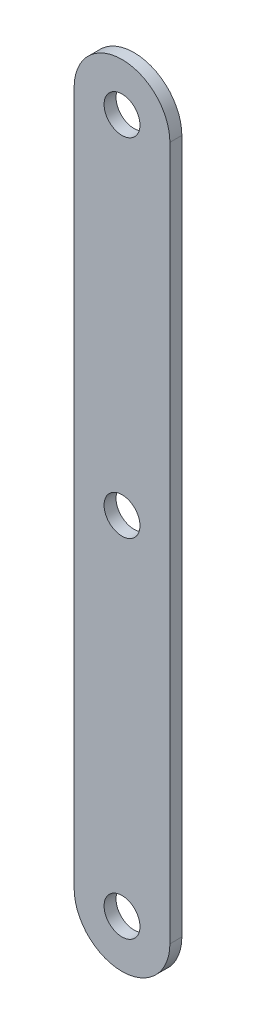
ISO-10303-21;
HEADER;
FILE_DESCRIPTION(('STEP AP214'),'2;1');
FILE_NAME('part.step','',(''),(''),'','','');
FILE_SCHEMA(('AUTOMOTIVE_DESIGN { 1 0 10303 214 1 1 1 1 }'));
ENDSEC;
DATA;
#1=APPLICATION_CONTEXT('core data for automotive mechanical design processes');
#2=APPLICATION_PROTOCOL_DEFINITION('international standard','automotive_design',2000,#1);
#3=PRODUCT_CONTEXT('',#1,'mechanical');
#4=PRODUCT('Part','Part','',(#3));
#5=PRODUCT_RELATED_PRODUCT_CATEGORY('part','',(#4));
#6=PRODUCT_DEFINITION_FORMATION('','',#4);
#7=PRODUCT_DEFINITION_CONTEXT('part definition',#1,'design');
#8=PRODUCT_DEFINITION('design','',#6,#7);
#9=PRODUCT_DEFINITION_SHAPE('','',#8);
#10=(LENGTH_UNIT() NAMED_UNIT(*) SI_UNIT(.MILLI.,.METRE.));
#11=(NAMED_UNIT(*) PLANE_ANGLE_UNIT() SI_UNIT($,.RADIAN.));
#12=(NAMED_UNIT(*) SI_UNIT($,.STERADIAN.) SOLID_ANGLE_UNIT());
#13=UNCERTAINTY_MEASURE_WITH_UNIT(LENGTH_MEASURE(1.E-05),#10,'distance_accuracy_value','');
#14=(GEOMETRIC_REPRESENTATION_CONTEXT(3) GLOBAL_UNCERTAINTY_ASSIGNED_CONTEXT((#13)) GLOBAL_UNIT_ASSIGNED_CONTEXT((#10,
#11,#12)) REPRESENTATION_CONTEXT('',''));
#15=CARTESIAN_POINT('',(0.,0.,0.));
#16=DIRECTION('',(0.,0.,1.));
#17=DIRECTION('',(1.,0.,0.));
#18=AXIS2_PLACEMENT_3D('',#15,#16,#17);
#19=CARTESIAN_POINT('',(0.,-145.,5.));
#20=DIRECTION('',(0.,0.,1.));
#21=DIRECTION('',(1.,0.,0.));
#22=AXIS2_PLACEMENT_3D('',#19,#20,#21);
#23=PLANE('',#22);
#24=CARTESIAN_POINT('',(0.,0.,5.));
#25=DIRECTION('',(0.,0.,1.));
#26=DIRECTION('',(1.,0.,0.));
#27=AXIS2_PLACEMENT_3D('',#24,#25,#26);
#28=CIRCLE('',#27,7.5);
#29=CARTESIAN_POINT('',(7.5,0.,5.));
#30=VERTEX_POINT('',#29);
#31=EDGE_CURVE('E115',#30,#30,#28,.T.);
#32=ORIENTED_EDGE('',*,*,#31,.F.);
#33=EDGE_LOOP('',(#32));
#34=FACE_BOUND('',#33,.T.);
#35=CARTESIAN_POINT('',(0.,-145.,5.));
#36=DIRECTION('',(0.,0.,1.));
#37=DIRECTION('',(1.,0.,0.));
#38=AXIS2_PLACEMENT_3D('',#35,#36,#37);
#39=CIRCLE('',#38,20.);
#40=CARTESIAN_POINT('',(-20.,-145.,5.));
#41=VERTEX_POINT('',#40);
#42=CARTESIAN_POINT('',(20.,-145.,5.));
#43=VERTEX_POINT('',#42);
#44=EDGE_CURVE('E85',#41,#43,#39,.T.);
#45=ORIENTED_EDGE('',*,*,#44,.T.);
#46=DIRECTION('',(0.,1.,0.));
#47=VECTOR('',#46,1.);
#48=CARTESIAN_POINT('',(20.,-145.,5.));
#49=LINE('',#48,#47);
#50=CARTESIAN_POINT('',(20.,145.,5.));
#51=VERTEX_POINT('',#50);
#52=EDGE_CURVE('E80',#43,#51,#49,.T.);
#53=ORIENTED_EDGE('',*,*,#52,.T.);
#54=CARTESIAN_POINT('',(0.,145.,5.));
#55=DIRECTION('',(0.,0.,1.));
#56=DIRECTION('',(1.,0.,0.));
#57=AXIS2_PLACEMENT_3D('',#54,#55,#56);
#58=CIRCLE('',#57,20.);
#59=CARTESIAN_POINT('',(-20.,145.,5.));
#60=VERTEX_POINT('',#59);
#61=EDGE_CURVE('E83',#51,#60,#58,.T.);
#62=ORIENTED_EDGE('',*,*,#61,.T.);
#63=DIRECTION('',(0.,-1.,0.));
#64=VECTOR('',#63,1.);
#65=CARTESIAN_POINT('',(-20.,-145.,5.));
#66=LINE('',#65,#64);
#67=EDGE_CURVE('E50',#60,#41,#66,.T.);
#68=ORIENTED_EDGE('',*,*,#67,.T.);
#69=EDGE_LOOP('',(#45,#53,#62,#68));
#70=FACE_BOUND('',#69,.T.);
#71=CARTESIAN_POINT('',(0.,145.,5.));
#72=DIRECTION('',(0.,0.,1.));
#73=DIRECTION('',(1.,0.,0.));
#74=AXIS2_PLACEMENT_3D('',#71,#72,#73);
#75=CIRCLE('',#74,7.50000000000002);
#76=CARTESIAN_POINT('',(7.50000000000002,145.,5.));
#77=VERTEX_POINT('',#76);
#78=EDGE_CURVE('E100',#77,#77,#75,.T.);
#79=ORIENTED_EDGE('',*,*,#78,.F.);
#80=EDGE_LOOP('',(#79));
#81=FACE_BOUND('',#80,.T.);
#82=CARTESIAN_POINT('',(0.,-145.,5.));
#83=DIRECTION('',(0.,0.,1.));
#84=DIRECTION('',(1.,0.,0.));
#85=AXIS2_PLACEMENT_3D('',#82,#83,#84);
#86=CIRCLE('',#85,7.50000000000002);
#87=CARTESIAN_POINT('',(7.50000000000002,-145.,5.));
#88=VERTEX_POINT('',#87);
#89=EDGE_CURVE('E121',#88,#88,#86,.T.);
#90=ORIENTED_EDGE('',*,*,#89,.F.);
#91=EDGE_LOOP('',(#90));
#92=FACE_BOUND('',#91,.T.);
#93=ADVANCED_FACE('F33',(#34,#70,#81,#92),#23,.T.);
#94=CARTESIAN_POINT('',(0.,-145.,0.));
#95=DIRECTION('',(0.,0.,1.));
#96=DIRECTION('',(1.,0.,0.));
#97=AXIS2_PLACEMENT_3D('',#94,#95,#96);
#98=PLANE('',#97);
#99=CARTESIAN_POINT('',(0.,-145.,0.));
#100=DIRECTION('',(0.,0.,1.));
#101=DIRECTION('',(1.,0.,0.));
#102=AXIS2_PLACEMENT_3D('',#99,#100,#101);
#103=CIRCLE('',#102,20.);
#104=CARTESIAN_POINT('',(-20.,-145.,0.));
#105=VERTEX_POINT('',#104);
#106=CARTESIAN_POINT('',(20.,-145.,0.));
#107=VERTEX_POINT('',#106);
#108=EDGE_CURVE('E97',#105,#107,#103,.T.);
#109=ORIENTED_EDGE('',*,*,#108,.F.);
#110=DIRECTION('',(0.,-1.,0.));
#111=VECTOR('',#110,1.);
#112=CARTESIAN_POINT('',(-20.,-145.,0.));
#113=LINE('',#112,#111);
#114=CARTESIAN_POINT('',(-20.,145.,0.));
#115=VERTEX_POINT('',#114);
#116=EDGE_CURVE('E73',#115,#105,#113,.T.);
#117=ORIENTED_EDGE('',*,*,#116,.F.);
#118=CARTESIAN_POINT('',(0.,145.,0.));
#119=DIRECTION('',(0.,0.,1.));
#120=DIRECTION('',(1.,0.,0.));
#121=AXIS2_PLACEMENT_3D('',#118,#119,#120);
#122=CIRCLE('',#121,20.);
#123=CARTESIAN_POINT('',(20.,145.,0.));
#124=VERTEX_POINT('',#123);
#125=EDGE_CURVE('E67',#124,#115,#122,.T.);
#126=ORIENTED_EDGE('',*,*,#125,.F.);
#127=DIRECTION('',(0.,1.,0.));
#128=VECTOR('',#127,1.);
#129=CARTESIAN_POINT('',(20.,-145.,0.));
#130=LINE('',#129,#128);
#131=EDGE_CURVE('E89',#107,#124,#130,.T.);
#132=ORIENTED_EDGE('',*,*,#131,.F.);
#133=EDGE_LOOP('',(#109,#117,#126,#132));
#134=FACE_BOUND('',#133,.T.);
#135=CARTESIAN_POINT('',(0.,145.,0.));
#136=DIRECTION('',(0.,0.,1.));
#137=DIRECTION('',(1.,0.,0.));
#138=AXIS2_PLACEMENT_3D('',#135,#136,#137);
#139=CIRCLE('',#138,7.50000000000002);
#140=CARTESIAN_POINT('',(7.50000000000002,145.,0.));
#141=VERTEX_POINT('',#140);
#142=EDGE_CURVE('E112',#141,#141,#139,.T.);
#143=ORIENTED_EDGE('',*,*,#142,.T.);
#144=EDGE_LOOP('',(#143));
#145=FACE_BOUND('',#144,.T.);
#146=CARTESIAN_POINT('',(0.,0.,0.));
#147=DIRECTION('',(0.,0.,1.));
#148=DIRECTION('',(1.,0.,0.));
#149=AXIS2_PLACEMENT_3D('',#146,#147,#148);
#150=CIRCLE('',#149,7.5);
#151=CARTESIAN_POINT('',(7.5,0.,0.));
#152=VERTEX_POINT('',#151);
#153=EDGE_CURVE('E118',#152,#152,#150,.T.);
#154=ORIENTED_EDGE('',*,*,#153,.T.);
#155=EDGE_LOOP('',(#154));
#156=FACE_BOUND('',#155,.T.);
#157=CARTESIAN_POINT('',(0.,-145.,0.));
#158=DIRECTION('',(0.,0.,1.));
#159=DIRECTION('',(1.,0.,0.));
#160=AXIS2_PLACEMENT_3D('',#157,#158,#159);
#161=CIRCLE('',#160,7.50000000000002);
#162=CARTESIAN_POINT('',(7.50000000000002,-145.,0.));
#163=VERTEX_POINT('',#162);
#164=EDGE_CURVE('E124',#163,#163,#161,.T.);
#165=ORIENTED_EDGE('',*,*,#164,.T.);
#166=EDGE_LOOP('',(#165));
#167=FACE_BOUND('',#166,.T.);
#168=ADVANCED_FACE('F108',(#134,#145,#156,#167),#98,.F.);
#169=CARTESIAN_POINT('',(0.,-145.,5.));
#170=DIRECTION('',(0.,0.,-1.));
#171=DIRECTION('',(-1.,0.,0.));
#172=AXIS2_PLACEMENT_3D('',#169,#170,#171);
#173=CYLINDRICAL_SURFACE('',#172,20.);
#174=ORIENTED_EDGE('',*,*,#108,.T.);
#175=DIRECTION('',(0.,0.,-1.));
#176=VECTOR('',#175,1.);
#177=CARTESIAN_POINT('',(20.,-145.,5.));
#178=LINE('',#177,#176);
#179=EDGE_CURVE('E11',#43,#107,#178,.T.);
#180=ORIENTED_EDGE('',*,*,#179,.F.);
#181=ORIENTED_EDGE('',*,*,#44,.F.);
#182=DIRECTION('',(0.,0.,-1.));
#183=VECTOR('',#182,1.);
#184=CARTESIAN_POINT('',(-20.,-145.,5.));
#185=LINE('',#184,#183);
#186=EDGE_CURVE('E93',#41,#105,#185,.T.);
#187=ORIENTED_EDGE('',*,*,#186,.T.);
#188=EDGE_LOOP('',(#174,#180,#181,#187));
#189=FACE_BOUND('',#188,.T.);
#190=ADVANCED_FACE('F35',(#189),#173,.T.);
#191=CARTESIAN_POINT('',(20.,-145.,5.));
#192=DIRECTION('',(-1.,0.,0.));
#193=DIRECTION('',(0.,0.,1.));
#194=AXIS2_PLACEMENT_3D('',#191,#192,#193);
#195=PLANE('',#194);
#196=ORIENTED_EDGE('',*,*,#131,.T.);
#197=DIRECTION('',(0.,0.,-1.));
#198=VECTOR('',#197,1.);
#199=CARTESIAN_POINT('',(20.,145.,5.));
#200=LINE('',#199,#198);
#201=EDGE_CURVE('E42',#51,#124,#200,.T.);
#202=ORIENTED_EDGE('',*,*,#201,.F.);
#203=ORIENTED_EDGE('',*,*,#52,.F.);
#204=ORIENTED_EDGE('',*,*,#179,.T.);
#205=EDGE_LOOP('',(#196,#202,#203,#204));
#206=FACE_BOUND('',#205,.T.);
#207=ADVANCED_FACE('F88',(#206),#195,.F.);
#208=CARTESIAN_POINT('',(0.,145.,5.));
#209=DIRECTION('',(0.,0.,-1.));
#210=DIRECTION('',(-1.,0.,0.));
#211=AXIS2_PLACEMENT_3D('',#208,#209,#210);
#212=CYLINDRICAL_SURFACE('',#211,20.);
#213=ORIENTED_EDGE('',*,*,#125,.T.);
#214=DIRECTION('',(0.,0.,-1.));
#215=VECTOR('',#214,1.);
#216=CARTESIAN_POINT('',(-20.,145.,5.));
#217=LINE('',#216,#215);
#218=EDGE_CURVE('E90',#60,#115,#217,.T.);
#219=ORIENTED_EDGE('',*,*,#218,.F.);
#220=ORIENTED_EDGE('',*,*,#61,.F.);
#221=ORIENTED_EDGE('',*,*,#201,.T.);
#222=EDGE_LOOP('',(#213,#219,#220,#221));
#223=FACE_BOUND('',#222,.T.);
#224=ADVANCED_FACE('F91',(#223),#212,.T.);
#225=CARTESIAN_POINT('',(-20.,-145.,5.));
#226=DIRECTION('',(1.,0.,0.));
#227=DIRECTION('',(0.,0.,-1.));
#228=AXIS2_PLACEMENT_3D('',#225,#226,#227);
#229=PLANE('',#228);
#230=ORIENTED_EDGE('',*,*,#116,.T.);
#231=ORIENTED_EDGE('',*,*,#186,.F.);
#232=ORIENTED_EDGE('',*,*,#67,.F.);
#233=ORIENTED_EDGE('',*,*,#218,.T.);
#234=EDGE_LOOP('',(#230,#231,#232,#233));
#235=FACE_BOUND('',#234,.T.);
#236=ADVANCED_FACE('F105',(#235),#229,.F.);
#237=CARTESIAN_POINT('',(0.,145.,5.));
#238=DIRECTION('',(0.,0.,-1.));
#239=DIRECTION('',(-1.,0.,0.));
#240=AXIS2_PLACEMENT_3D('',#237,#238,#239);
#241=CYLINDRICAL_SURFACE('',#240,7.50000000000002);
#242=ORIENTED_EDGE('',*,*,#78,.T.);
#243=EDGE_LOOP('',(#242));
#244=FACE_BOUND('',#243,.T.);
#245=ORIENTED_EDGE('',*,*,#142,.F.);
#246=EDGE_LOOP('',(#245));
#247=FACE_BOUND('',#246,.T.);
#248=ADVANCED_FACE('F142',(#244,#247),#241,.F.);
#249=CARTESIAN_POINT('',(0.,0.,5.));
#250=DIRECTION('',(0.,0.,-1.));
#251=DIRECTION('',(-1.,0.,0.));
#252=AXIS2_PLACEMENT_3D('',#249,#250,#251);
#253=CYLINDRICAL_SURFACE('',#252,7.5);
#254=ORIENTED_EDGE('',*,*,#31,.T.);
#255=EDGE_LOOP('',(#254));
#256=FACE_BOUND('',#255,.T.);
#257=ORIENTED_EDGE('',*,*,#153,.F.);
#258=EDGE_LOOP('',(#257));
#259=FACE_BOUND('',#258,.T.);
#260=ADVANCED_FACE('F188',(#256,#259),#253,.F.);
#261=CARTESIAN_POINT('',(0.,-145.,5.));
#262=DIRECTION('',(0.,0.,-1.));
#263=DIRECTION('',(-1.,0.,0.));
#264=AXIS2_PLACEMENT_3D('',#261,#262,#263);
#265=CYLINDRICAL_SURFACE('',#264,7.50000000000002);
#266=ORIENTED_EDGE('',*,*,#89,.T.);
#267=EDGE_LOOP('',(#266));
#268=FACE_BOUND('',#267,.T.);
#269=ORIENTED_EDGE('',*,*,#164,.F.);
#270=EDGE_LOOP('',(#269));
#271=FACE_BOUND('',#270,.T.);
#272=ADVANCED_FACE('F130',(#268,#271),#265,.F.);
#273=CLOSED_SHELL('',(#93,#168,#190,#207,#224,#236,#248,#260,#272));
#274=MANIFOLD_SOLID_BREP('B2',#273);
#275=ADVANCED_BREP_SHAPE_REPRESENTATION('',(#18,#274),#14);
#276=SHAPE_DEFINITION_REPRESENTATION(#9,#275);
ENDSEC;
END-ISO-10303-21;
